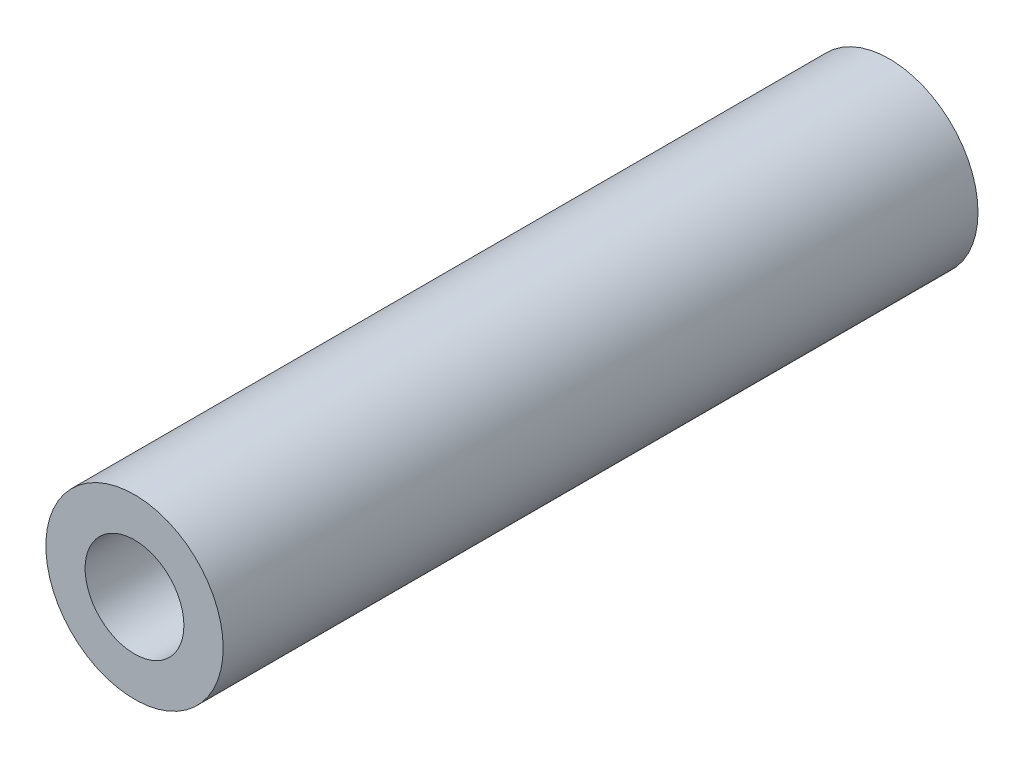
ISO-10303-21;
HEADER;
FILE_DESCRIPTION(('STEP AP214'),'2;1');
FILE_NAME('part.step','',(''),(''),'','','');
FILE_SCHEMA(('AUTOMOTIVE_DESIGN { 1 0 10303 214 1 1 1 1 }'));
ENDSEC;
DATA;
#1=APPLICATION_CONTEXT('core data for automotive mechanical design processes');
#2=APPLICATION_PROTOCOL_DEFINITION('international standard','automotive_design',2000,#1);
#3=PRODUCT_CONTEXT('',#1,'mechanical');
#4=PRODUCT('Part','Part','',(#3));
#5=PRODUCT_RELATED_PRODUCT_CATEGORY('part','',(#4));
#6=PRODUCT_DEFINITION_FORMATION('','',#4);
#7=PRODUCT_DEFINITION_CONTEXT('part definition',#1,'design');
#8=PRODUCT_DEFINITION('design','',#6,#7);
#9=PRODUCT_DEFINITION_SHAPE('','',#8);
#10=(LENGTH_UNIT() NAMED_UNIT(*) SI_UNIT(.MILLI.,.METRE.));
#11=(NAMED_UNIT(*) PLANE_ANGLE_UNIT() SI_UNIT($,.RADIAN.));
#12=(NAMED_UNIT(*) SI_UNIT($,.STERADIAN.) SOLID_ANGLE_UNIT());
#13=UNCERTAINTY_MEASURE_WITH_UNIT(LENGTH_MEASURE(1.E-05),#10,'distance_accuracy_value','');
#14=(GEOMETRIC_REPRESENTATION_CONTEXT(3) GLOBAL_UNCERTAINTY_ASSIGNED_CONTEXT((#13)) GLOBAL_UNIT_ASSIGNED_CONTEXT((#10,
#11,#12)) REPRESENTATION_CONTEXT('',''));
#15=CARTESIAN_POINT('',(0.,0.,0.));
#16=DIRECTION('',(0.,0.,1.));
#17=DIRECTION('',(1.,0.,0.));
#18=AXIS2_PLACEMENT_3D('',#15,#16,#17);
#19=CARTESIAN_POINT('',(0.,0.,149.));
#20=DIRECTION('',(0.,0.,1.));
#21=DIRECTION('',(1.,0.,0.));
#22=AXIS2_PLACEMENT_3D('',#19,#20,#21);
#23=PLANE('',#22);
#24=CARTESIAN_POINT('',(0.,0.,149.));
#25=DIRECTION('',(0.,0.,1.));
#26=DIRECTION('',(1.,0.,0.));
#27=AXIS2_PLACEMENT_3D('',#24,#25,#26);
#28=CIRCLE('',#27,17.5);
#29=CARTESIAN_POINT('',(17.5,0.,149.));
#30=VERTEX_POINT('',#29);
#31=EDGE_CURVE('E10',#30,#30,#28,.T.);
#32=ORIENTED_EDGE('',*,*,#31,.T.);
#33=EDGE_LOOP('',(#32));
#34=FACE_BOUND('',#33,.T.);
#35=CARTESIAN_POINT('',(0.,0.,149.));
#36=DIRECTION('',(0.,0.,1.));
#37=DIRECTION('',(1.,0.,0.));
#38=AXIS2_PLACEMENT_3D('',#35,#36,#37);
#39=CIRCLE('',#38,9.75);
#40=CARTESIAN_POINT('',(9.75,0.,149.));
#41=VERTEX_POINT('',#40);
#42=EDGE_CURVE('E41',#41,#41,#39,.T.);
#43=ORIENTED_EDGE('',*,*,#42,.F.);
#44=EDGE_LOOP('',(#43));
#45=FACE_BOUND('',#44,.T.);
#46=ADVANCED_FACE('F30',(#34,#45),#23,.T.);
#47=CARTESIAN_POINT('',(0.,0.,0.));
#48=DIRECTION('',(0.,0.,1.));
#49=DIRECTION('',(1.,0.,0.));
#50=AXIS2_PLACEMENT_3D('',#47,#48,#49);
#51=PLANE('',#50);
#52=CARTESIAN_POINT('',(0.,0.,0.));
#53=DIRECTION('',(0.,0.,1.));
#54=DIRECTION('',(1.,0.,0.));
#55=AXIS2_PLACEMENT_3D('',#52,#53,#54);
#56=CIRCLE('',#55,17.5);
#57=CARTESIAN_POINT('',(17.5,0.,0.));
#58=VERTEX_POINT('',#57);
#59=EDGE_CURVE('E34',#58,#58,#56,.T.);
#60=ORIENTED_EDGE('',*,*,#59,.F.);
#61=EDGE_LOOP('',(#60));
#62=FACE_BOUND('',#61,.T.);
#63=CARTESIAN_POINT('',(0.,0.,0.));
#64=DIRECTION('',(0.,0.,1.));
#65=DIRECTION('',(1.,0.,0.));
#66=AXIS2_PLACEMENT_3D('',#63,#64,#65);
#67=CIRCLE('',#66,9.75);
#68=CARTESIAN_POINT('',(9.75,0.,0.));
#69=VERTEX_POINT('',#68);
#70=EDGE_CURVE('E43',#69,#69,#67,.T.);
#71=ORIENTED_EDGE('',*,*,#70,.T.);
#72=EDGE_LOOP('',(#71));
#73=FACE_BOUND('',#72,.T.);
#74=ADVANCED_FACE('F53',(#62,#73),#51,.F.);
#75=CARTESIAN_POINT('',(0.,0.,149.));
#76=DIRECTION('',(0.,0.,-1.));
#77=DIRECTION('',(-1.,0.,0.));
#78=AXIS2_PLACEMENT_3D('',#75,#76,#77);
#79=CYLINDRICAL_SURFACE('',#78,17.5);
#80=ORIENTED_EDGE('',*,*,#31,.F.);
#81=EDGE_LOOP('',(#80));
#82=FACE_BOUND('',#81,.T.);
#83=ORIENTED_EDGE('',*,*,#59,.T.);
#84=EDGE_LOOP('',(#83));
#85=FACE_BOUND('',#84,.T.);
#86=ADVANCED_FACE('F32',(#82,#85),#79,.T.);
#87=CARTESIAN_POINT('',(0.,0.,149.));
#88=DIRECTION('',(0.,0.,-1.));
#89=DIRECTION('',(-1.,0.,0.));
#90=AXIS2_PLACEMENT_3D('',#87,#88,#89);
#91=CYLINDRICAL_SURFACE('',#90,9.75);
#92=ORIENTED_EDGE('',*,*,#42,.T.);
#93=EDGE_LOOP('',(#92));
#94=FACE_BOUND('',#93,.T.);
#95=ORIENTED_EDGE('',*,*,#70,.F.);
#96=EDGE_LOOP('',(#95));
#97=FACE_BOUND('',#96,.T.);
#98=ADVANCED_FACE('F49',(#94,#97),#91,.F.);
#99=CLOSED_SHELL('',(#46,#74,#86,#98));
#100=MANIFOLD_SOLID_BREP('B2',#99);
#101=ADVANCED_BREP_SHAPE_REPRESENTATION('',(#18,#100),#14);
#102=SHAPE_DEFINITION_REPRESENTATION(#9,#101);
ENDSEC;
END-ISO-10303-21;
